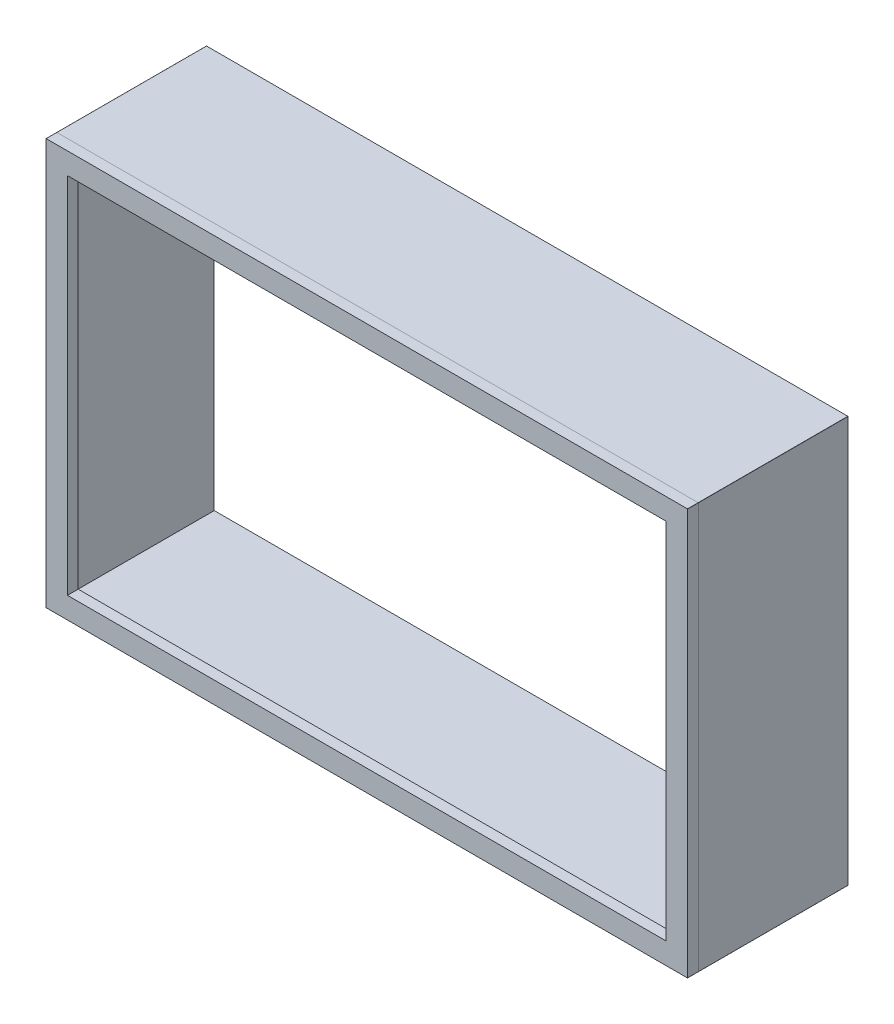
ISO-10303-21;
HEADER;
FILE_DESCRIPTION(('STEP AP214'),'2;1');
FILE_NAME('part.step','',(''),(''),'','','');
FILE_SCHEMA(('AUTOMOTIVE_DESIGN { 1 0 10303 214 1 1 1 1 }'));
ENDSEC;
DATA;
#1=APPLICATION_CONTEXT('core data for automotive mechanical design processes');
#2=APPLICATION_PROTOCOL_DEFINITION('international standard','automotive_design',2000,#1);
#3=PRODUCT_CONTEXT('',#1,'mechanical');
#4=PRODUCT('Part','Part','',(#3));
#5=PRODUCT_RELATED_PRODUCT_CATEGORY('part','',(#4));
#6=PRODUCT_DEFINITION_FORMATION('','',#4);
#7=PRODUCT_DEFINITION_CONTEXT('part definition',#1,'design');
#8=PRODUCT_DEFINITION('design','',#6,#7);
#9=PRODUCT_DEFINITION_SHAPE('','',#8);
#10=(LENGTH_UNIT() NAMED_UNIT(*) SI_UNIT(.MILLI.,.METRE.));
#11=(NAMED_UNIT(*) PLANE_ANGLE_UNIT() SI_UNIT($,.RADIAN.));
#12=(NAMED_UNIT(*) SI_UNIT($,.STERADIAN.) SOLID_ANGLE_UNIT());
#13=UNCERTAINTY_MEASURE_WITH_UNIT(LENGTH_MEASURE(1.E-05),#10,'distance_accuracy_value','');
#14=(GEOMETRIC_REPRESENTATION_CONTEXT(3) GLOBAL_UNCERTAINTY_ASSIGNED_CONTEXT((#13)) GLOBAL_UNIT_ASSIGNED_CONTEXT((#10,
#11,#12)) REPRESENTATION_CONTEXT('',''));
#15=CARTESIAN_POINT('',(0.,0.,0.));
#16=DIRECTION('',(0.,0.,1.));
#17=DIRECTION('',(1.,0.,0.));
#18=AXIS2_PLACEMENT_3D('',#15,#16,#17);
#19=CARTESIAN_POINT('',(-761.746,-482.346,228.6));
#20=DIRECTION('',(0.,0.,1.));
#21=DIRECTION('',(1.,0.,0.));
#22=AXIS2_PLACEMENT_3D('',#19,#20,#21);
#23=PLANE('',#22);
#24=CARTESIAN_POINT('',(-761.746,-482.346,228.6));
#25=DIRECTION('',(0.,0.,1.));
#26=DIRECTION('',(1.,0.,0.));
#27=AXIS2_PLACEMENT_3D('',#24,#25,#26);
#28=CIRCLE('',#27,0.253999999999921);
#29=CARTESIAN_POINT('',(-762.,-482.346,228.6));
#30=VERTEX_POINT('',#29);
#31=CARTESIAN_POINT('',(-761.746,-482.6,228.6));
#32=VERTEX_POINT('',#31);
#33=EDGE_CURVE('E278',#30,#32,#28,.T.);
#34=ORIENTED_EDGE('',*,*,#33,.T.);
#35=DIRECTION('',(1.,0.,0.));
#36=VECTOR('',#35,1.);
#37=CARTESIAN_POINT('',(-761.746,-482.6,228.6));
#38=LINE('',#37,#36);
#39=CARTESIAN_POINT('',(761.746,-482.6,228.6));
#40=VERTEX_POINT('',#39);
#41=EDGE_CURVE('E281',#32,#40,#38,.T.);
#42=ORIENTED_EDGE('',*,*,#41,.T.);
#43=CARTESIAN_POINT('',(761.746,-482.346,228.6));
#44=DIRECTION('',(0.,0.,1.));
#45=DIRECTION('',(1.,0.,0.));
#46=AXIS2_PLACEMENT_3D('',#43,#44,#45);
#47=CIRCLE('',#46,0.254000000000004);
#48=CARTESIAN_POINT('',(762.,-482.346,228.6));
#49=VERTEX_POINT('',#48);
#50=EDGE_CURVE('E284',#40,#49,#47,.T.);
#51=ORIENTED_EDGE('',*,*,#50,.T.);
#52=DIRECTION('',(0.,1.,0.));
#53=VECTOR('',#52,1.);
#54=CARTESIAN_POINT('',(762.,-482.346,228.6));
#55=LINE('',#54,#53);
#56=CARTESIAN_POINT('',(762.,482.346,228.6));
#57=VERTEX_POINT('',#56);
#58=EDGE_CURVE('E286',#49,#57,#55,.T.);
#59=ORIENTED_EDGE('',*,*,#58,.T.);
#60=CARTESIAN_POINT('',(761.746,482.346,228.6));
#61=DIRECTION('',(0.,0.,1.));
#62=DIRECTION('',(1.,0.,0.));
#63=AXIS2_PLACEMENT_3D('',#60,#61,#62);
#64=CIRCLE('',#63,0.253999999999976);
#65=CARTESIAN_POINT('',(761.746,482.6,228.6));
#66=VERTEX_POINT('',#65);
#67=EDGE_CURVE('E288',#57,#66,#64,.T.);
#68=ORIENTED_EDGE('',*,*,#67,.T.);
#69=DIRECTION('',(-1.,0.,0.));
#70=VECTOR('',#69,1.);
#71=CARTESIAN_POINT('',(761.746,482.6,228.6));
#72=LINE('',#71,#70);
#73=CARTESIAN_POINT('',(-761.746,482.6,228.6));
#74=VERTEX_POINT('',#73);
#75=EDGE_CURVE('E290',#66,#74,#72,.T.);
#76=ORIENTED_EDGE('',*,*,#75,.T.);
#77=CARTESIAN_POINT('',(-761.746,482.346,228.6));
#78=DIRECTION('',(0.,0.,1.));
#79=DIRECTION('',(1.,0.,0.));
#80=AXIS2_PLACEMENT_3D('',#77,#78,#79);
#81=CIRCLE('',#80,0.253999999999976);
#82=CARTESIAN_POINT('',(-762.,482.346,228.6));
#83=VERTEX_POINT('',#82);
#84=EDGE_CURVE('E292',#74,#83,#81,.T.);
#85=ORIENTED_EDGE('',*,*,#84,.T.);
#86=DIRECTION('',(0.,-1.,0.));
#87=VECTOR('',#86,1.);
#88=CARTESIAN_POINT('',(-762.,482.346,228.6));
#89=LINE('',#88,#87);
#90=EDGE_CURVE('E294',#83,#30,#89,.T.);
#91=ORIENTED_EDGE('',*,*,#90,.T.);
#92=EDGE_LOOP('',(#34,#42,#51,#59,#68,#76,#85,#91));
#93=FACE_BOUND('',#92,.T.);
#94=DIRECTION('',(0.,1.,0.));
#95=VECTOR('',#94,1.);
#96=CARTESIAN_POINT('',(711.2,-482.346,228.6));
#97=LINE('',#96,#95);
#98=CARTESIAN_POINT('',(711.2,-431.8,228.6));
#99=VERTEX_POINT('',#98);
#100=CARTESIAN_POINT('',(711.2,431.8,228.6));
#101=VERTEX_POINT('',#100);
#102=EDGE_CURVE('E250',#99,#101,#97,.T.);
#103=ORIENTED_EDGE('',*,*,#102,.F.);
#104=DIRECTION('',(1.,0.,0.));
#105=VECTOR('',#104,1.);
#106=CARTESIAN_POINT('',(-761.746,-431.8,228.6));
#107=LINE('',#106,#105);
#108=CARTESIAN_POINT('',(-711.2,-431.8,228.6));
#109=VERTEX_POINT('',#108);
#110=EDGE_CURVE('E242',#109,#99,#107,.T.);
#111=ORIENTED_EDGE('',*,*,#110,.F.);
#112=DIRECTION('',(0.,-1.,0.));
#113=VECTOR('',#112,1.);
#114=CARTESIAN_POINT('',(-711.2,482.346,228.6));
#115=LINE('',#114,#113);
#116=CARTESIAN_POINT('',(-711.2,431.8,228.6));
#117=VERTEX_POINT('',#116);
#118=EDGE_CURVE('E264',#117,#109,#115,.T.);
#119=ORIENTED_EDGE('',*,*,#118,.F.);
#120=DIRECTION('',(-1.,0.,0.));
#121=VECTOR('',#120,1.);
#122=CARTESIAN_POINT('',(761.746,431.8,228.6));
#123=LINE('',#122,#121);
#124=EDGE_CURVE('E262',#101,#117,#123,.T.);
#125=ORIENTED_EDGE('',*,*,#124,.F.);
#126=EDGE_LOOP('',(#103,#111,#119,#125));
#127=FACE_BOUND('',#126,.T.);
#128=ADVANCED_FACE('F153',(#93,#127),#23,.T.);
#129=CARTESIAN_POINT('',(-761.746,-482.346,203.2));
#130=DIRECTION('',(0.,0.,1.));
#131=DIRECTION('',(1.,0.,0.));
#132=AXIS2_PLACEMENT_3D('',#129,#130,#131);
#133=PLANE('',#132);
#134=CARTESIAN_POINT('',(-761.746,-482.346,203.2));
#135=DIRECTION('',(0.,0.,1.));
#136=DIRECTION('',(1.,0.,0.));
#137=AXIS2_PLACEMENT_3D('',#134,#135,#136);
#138=CIRCLE('',#137,0.253999999999921);
#139=CARTESIAN_POINT('',(-762.,-482.346,203.2));
#140=VERTEX_POINT('',#139);
#141=CARTESIAN_POINT('',(-761.746,-482.6,203.2));
#142=VERTEX_POINT('',#141);
#143=EDGE_CURVE('E258',#140,#142,#138,.T.);
#144=ORIENTED_EDGE('',*,*,#143,.F.);
#145=DIRECTION('',(0.,-1.,0.));
#146=VECTOR('',#145,1.);
#147=CARTESIAN_POINT('',(-762.,482.346,203.2));
#148=LINE('',#147,#146);
#149=CARTESIAN_POINT('',(-762.,482.346,203.2));
#150=VERTEX_POINT('',#149);
#151=EDGE_CURVE('E282',#150,#140,#148,.T.);
#152=ORIENTED_EDGE('',*,*,#151,.F.);
#153=CARTESIAN_POINT('',(-761.746,482.346,203.2));
#154=DIRECTION('',(0.,0.,1.));
#155=DIRECTION('',(1.,0.,0.));
#156=AXIS2_PLACEMENT_3D('',#153,#154,#155);
#157=CIRCLE('',#156,0.253999999999976);
#158=CARTESIAN_POINT('',(-761.746,482.6,203.2));
#159=VERTEX_POINT('',#158);
#160=EDGE_CURVE('E309',#159,#150,#157,.T.);
#161=ORIENTED_EDGE('',*,*,#160,.F.);
#162=DIRECTION('',(-1.,0.,0.));
#163=VECTOR('',#162,1.);
#164=CARTESIAN_POINT('',(761.746,482.6,203.2));
#165=LINE('',#164,#163);
#166=CARTESIAN_POINT('',(761.746,482.6,203.2));
#167=VERTEX_POINT('',#166);
#168=EDGE_CURVE('E307',#167,#159,#165,.T.);
#169=ORIENTED_EDGE('',*,*,#168,.F.);
#170=CARTESIAN_POINT('',(761.746,482.346,203.2));
#171=DIRECTION('',(0.,0.,1.));
#172=DIRECTION('',(1.,0.,0.));
#173=AXIS2_PLACEMENT_3D('',#170,#171,#172);
#174=CIRCLE('',#173,0.253999999999976);
#175=CARTESIAN_POINT('',(762.,482.346,203.2));
#176=VERTEX_POINT('',#175);
#177=EDGE_CURVE('E305',#176,#167,#174,.T.);
#178=ORIENTED_EDGE('',*,*,#177,.F.);
#179=DIRECTION('',(0.,1.,0.));
#180=VECTOR('',#179,1.);
#181=CARTESIAN_POINT('',(762.,-482.346,203.2));
#182=LINE('',#181,#180);
#183=CARTESIAN_POINT('',(762.,-482.346,203.2));
#184=VERTEX_POINT('',#183);
#185=EDGE_CURVE('E303',#184,#176,#182,.T.);
#186=ORIENTED_EDGE('',*,*,#185,.F.);
#187=CARTESIAN_POINT('',(761.746,-482.346,203.2));
#188=DIRECTION('',(0.,0.,1.));
#189=DIRECTION('',(1.,0.,0.));
#190=AXIS2_PLACEMENT_3D('',#187,#188,#189);
#191=CIRCLE('',#190,0.254000000000004);
#192=CARTESIAN_POINT('',(761.746,-482.6,203.2));
#193=VERTEX_POINT('',#192);
#194=EDGE_CURVE('E301',#193,#184,#191,.T.);
#195=ORIENTED_EDGE('',*,*,#194,.F.);
#196=DIRECTION('',(1.,0.,0.));
#197=VECTOR('',#196,1.);
#198=CARTESIAN_POINT('',(-761.746,-482.6,203.2));
#199=LINE('',#198,#197);
#200=EDGE_CURVE('E299',#142,#193,#199,.T.);
#201=ORIENTED_EDGE('',*,*,#200,.F.);
#202=EDGE_LOOP('',(#144,#152,#161,#169,#178,#186,#195,#201));
#203=FACE_BOUND('',#202,.T.);
#204=DIRECTION('',(1.,0.,0.));
#205=VECTOR('',#204,1.);
#206=CARTESIAN_POINT('',(-761.746,-431.8,203.2));
#207=LINE('',#206,#205);
#208=CARTESIAN_POINT('',(-711.2,-431.8,203.2));
#209=VERTEX_POINT('',#208);
#210=CARTESIAN_POINT('',(711.2,-431.8,203.2));
#211=VERTEX_POINT('',#210);
#212=EDGE_CURVE('E176',#209,#211,#207,.T.);
#213=ORIENTED_EDGE('',*,*,#212,.T.);
#214=DIRECTION('',(0.,1.,0.));
#215=VECTOR('',#214,1.);
#216=CARTESIAN_POINT('',(711.2,-482.346,203.2));
#217=LINE('',#216,#215);
#218=CARTESIAN_POINT('',(711.2,431.8,203.2));
#219=VERTEX_POINT('',#218);
#220=EDGE_CURVE('E257',#211,#219,#217,.T.);
#221=ORIENTED_EDGE('',*,*,#220,.T.);
#222=DIRECTION('',(-1.,0.,0.));
#223=VECTOR('',#222,1.);
#224=CARTESIAN_POINT('',(761.746,431.8,203.2));
#225=LINE('',#224,#223);
#226=CARTESIAN_POINT('',(-711.2,431.8,203.2));
#227=VERTEX_POINT('',#226);
#228=EDGE_CURVE('E270',#219,#227,#225,.T.);
#229=ORIENTED_EDGE('',*,*,#228,.T.);
#230=DIRECTION('',(0.,-1.,0.));
#231=VECTOR('',#230,1.);
#232=CARTESIAN_POINT('',(-711.2,482.346,203.2));
#233=LINE('',#232,#231);
#234=EDGE_CURVE('E251',#227,#209,#233,.T.);
#235=ORIENTED_EDGE('',*,*,#234,.T.);
#236=EDGE_LOOP('',(#213,#221,#229,#235));
#237=FACE_BOUND('',#236,.T.);
#238=ADVANCED_FACE('F339',(#203,#237),#133,.F.);
#239=CARTESIAN_POINT('',(-761.746,-482.346,228.6));
#240=DIRECTION('',(0.,0.,-1.));
#241=DIRECTION('',(-1.,0.,0.));
#242=AXIS2_PLACEMENT_3D('',#239,#240,#241);
#243=CYLINDRICAL_SURFACE('',#242,0.253999999999921);
#244=ORIENTED_EDGE('',*,*,#143,.T.);
#245=DIRECTION('',(0.,0.,-1.));
#246=VECTOR('',#245,1.);
#247=CARTESIAN_POINT('',(-761.746,-482.6,228.6));
#248=LINE('',#247,#246);
#249=EDGE_CURVE('E13',#32,#142,#248,.T.);
#250=ORIENTED_EDGE('',*,*,#249,.F.);
#251=ORIENTED_EDGE('',*,*,#33,.F.);
#252=DIRECTION('',(0.,0.,-1.));
#253=VECTOR('',#252,1.);
#254=CARTESIAN_POINT('',(-762.,-482.346,228.6));
#255=LINE('',#254,#253);
#256=EDGE_CURVE('E296',#30,#140,#255,.T.);
#257=ORIENTED_EDGE('',*,*,#256,.T.);
#258=EDGE_LOOP('',(#244,#250,#251,#257));
#259=FACE_BOUND('',#258,.T.);
#260=ADVANCED_FACE('F155',(#259),#243,.T.);
#261=CARTESIAN_POINT('',(-761.746,-482.6,228.6));
#262=DIRECTION('',(0.,1.,0.));
#263=DIRECTION('',(-1.,0.,0.));
#264=AXIS2_PLACEMENT_3D('',#261,#262,#263);
#265=PLANE('',#264);
#266=ORIENTED_EDGE('',*,*,#200,.T.);
#267=DIRECTION('',(0.,0.,-1.));
#268=VECTOR('',#267,1.);
#269=CARTESIAN_POINT('',(761.746,-482.6,228.6));
#270=LINE('',#269,#268);
#271=EDGE_CURVE('E161',#40,#193,#270,.T.);
#272=ORIENTED_EDGE('',*,*,#271,.F.);
#273=ORIENTED_EDGE('',*,*,#41,.F.);
#274=ORIENTED_EDGE('',*,*,#249,.T.);
#275=EDGE_LOOP('',(#266,#272,#273,#274));
#276=FACE_BOUND('',#275,.T.);
#277=ADVANCED_FACE('F356',(#276),#265,.F.);
#278=CARTESIAN_POINT('',(761.746,-482.346,228.6));
#279=DIRECTION('',(0.,0.,-1.));
#280=DIRECTION('',(-1.,0.,0.));
#281=AXIS2_PLACEMENT_3D('',#278,#279,#280);
#282=CYLINDRICAL_SURFACE('',#281,0.254000000000004);
#283=ORIENTED_EDGE('',*,*,#194,.T.);
#284=DIRECTION('',(0.,0.,-1.));
#285=VECTOR('',#284,1.);
#286=CARTESIAN_POINT('',(762.,-482.346,228.6));
#287=LINE('',#286,#285);
#288=EDGE_CURVE('E326',#49,#184,#287,.T.);
#289=ORIENTED_EDGE('',*,*,#288,.F.);
#290=ORIENTED_EDGE('',*,*,#50,.F.);
#291=ORIENTED_EDGE('',*,*,#271,.T.);
#292=EDGE_LOOP('',(#283,#289,#290,#291));
#293=FACE_BOUND('',#292,.T.);
#294=ADVANCED_FACE('F333',(#293),#282,.T.);
#295=CARTESIAN_POINT('',(762.,-482.346,228.6));
#296=DIRECTION('',(-1.,0.,0.));
#297=DIRECTION('',(0.,0.,1.));
#298=AXIS2_PLACEMENT_3D('',#295,#296,#297);
#299=PLANE('',#298);
#300=ORIENTED_EDGE('',*,*,#185,.T.);
#301=DIRECTION('',(0.,0.,-1.));
#302=VECTOR('',#301,1.);
#303=CARTESIAN_POINT('',(762.,482.346,228.6));
#304=LINE('',#303,#302);
#305=EDGE_CURVE('E323',#57,#176,#304,.T.);
#306=ORIENTED_EDGE('',*,*,#305,.F.);
#307=ORIENTED_EDGE('',*,*,#58,.F.);
#308=ORIENTED_EDGE('',*,*,#288,.T.);
#309=EDGE_LOOP('',(#300,#306,#307,#308));
#310=FACE_BOUND('',#309,.T.);
#311=ADVANCED_FACE('F345',(#310),#299,.F.);
#312=CARTESIAN_POINT('',(761.746,482.346,228.6));
#313=DIRECTION('',(0.,0.,-1.));
#314=DIRECTION('',(-1.,0.,0.));
#315=AXIS2_PLACEMENT_3D('',#312,#313,#314);
#316=CYLINDRICAL_SURFACE('',#315,0.253999999999976);
#317=ORIENTED_EDGE('',*,*,#177,.T.);
#318=DIRECTION('',(0.,0.,-1.));
#319=VECTOR('',#318,1.);
#320=CARTESIAN_POINT('',(761.746,482.6,228.6));
#321=LINE('',#320,#319);
#322=EDGE_CURVE('E320',#66,#167,#321,.T.);
#323=ORIENTED_EDGE('',*,*,#322,.F.);
#324=ORIENTED_EDGE('',*,*,#67,.F.);
#325=ORIENTED_EDGE('',*,*,#305,.T.);
#326=EDGE_LOOP('',(#317,#323,#324,#325));
#327=FACE_BOUND('',#326,.T.);
#328=ADVANCED_FACE('F349',(#327),#316,.T.);
#329=CARTESIAN_POINT('',(761.746,482.6,228.6));
#330=DIRECTION('',(0.,-1.,0.));
#331=DIRECTION('',(1.,0.,0.));
#332=AXIS2_PLACEMENT_3D('',#329,#330,#331);
#333=PLANE('',#332);
#334=ORIENTED_EDGE('',*,*,#168,.T.);
#335=DIRECTION('',(0.,0.,-1.));
#336=VECTOR('',#335,1.);
#337=CARTESIAN_POINT('',(-761.746,482.6,228.6));
#338=LINE('',#337,#336);
#339=EDGE_CURVE('E317',#74,#159,#338,.T.);
#340=ORIENTED_EDGE('',*,*,#339,.F.);
#341=ORIENTED_EDGE('',*,*,#75,.F.);
#342=ORIENTED_EDGE('',*,*,#322,.T.);
#343=EDGE_LOOP('',(#334,#340,#341,#342));
#344=FACE_BOUND('',#343,.T.);
#345=ADVANCED_FACE('F369',(#344),#333,.F.);
#346=CARTESIAN_POINT('',(-761.746,482.346,228.6));
#347=DIRECTION('',(0.,0.,-1.));
#348=DIRECTION('',(-1.,0.,0.));
#349=AXIS2_PLACEMENT_3D('',#346,#347,#348);
#350=CYLINDRICAL_SURFACE('',#349,0.253999999999976);
#351=ORIENTED_EDGE('',*,*,#160,.T.);
#352=DIRECTION('',(0.,0.,-1.));
#353=VECTOR('',#352,1.);
#354=CARTESIAN_POINT('',(-762.,482.346,228.6));
#355=LINE('',#354,#353);
#356=EDGE_CURVE('E314',#83,#150,#355,.T.);
#357=ORIENTED_EDGE('',*,*,#356,.F.);
#358=ORIENTED_EDGE('',*,*,#84,.F.);
#359=ORIENTED_EDGE('',*,*,#339,.T.);
#360=EDGE_LOOP('',(#351,#357,#358,#359));
#361=FACE_BOUND('',#360,.T.);
#362=ADVANCED_FACE('F367',(#361),#350,.T.);
#363=CARTESIAN_POINT('',(-762.,482.346,228.6));
#364=DIRECTION('',(1.,0.,0.));
#365=DIRECTION('',(0.,1.,0.));
#366=AXIS2_PLACEMENT_3D('',#363,#364,#365);
#367=PLANE('',#366);
#368=ORIENTED_EDGE('',*,*,#151,.T.);
#369=ORIENTED_EDGE('',*,*,#256,.F.);
#370=ORIENTED_EDGE('',*,*,#90,.F.);
#371=ORIENTED_EDGE('',*,*,#356,.T.);
#372=EDGE_LOOP('',(#368,#369,#370,#371));
#373=FACE_BOUND('',#372,.T.);
#374=ADVANCED_FACE('F362',(#373),#367,.F.);
#375=CARTESIAN_POINT('',(-761.746,-431.8,228.6));
#376=DIRECTION('',(0.,1.,0.));
#377=DIRECTION('',(-1.,0.,0.));
#378=AXIS2_PLACEMENT_3D('',#375,#376,#377);
#379=PLANE('',#378);
#380=ORIENTED_EDGE('',*,*,#212,.F.);
#381=DIRECTION('',(0.,0.,-1.));
#382=VECTOR('',#381,1.);
#383=CARTESIAN_POINT('',(-711.2,-431.8,228.6));
#384=LINE('',#383,#382);
#385=EDGE_CURVE('E246',#109,#209,#384,.T.);
#386=ORIENTED_EDGE('',*,*,#385,.F.);
#387=ORIENTED_EDGE('',*,*,#110,.T.);
#388=DIRECTION('',(0.,0.,-1.));
#389=VECTOR('',#388,1.);
#390=CARTESIAN_POINT('',(711.2,-431.8,228.6));
#391=LINE('',#390,#389);
#392=EDGE_CURVE('E245',#99,#211,#391,.T.);
#393=ORIENTED_EDGE('',*,*,#392,.T.);
#394=EDGE_LOOP('',(#380,#386,#387,#393));
#395=FACE_BOUND('',#394,.T.);
#396=ADVANCED_FACE('F244',(#395),#379,.T.);
#397=CARTESIAN_POINT('',(711.2,-482.346,228.6));
#398=DIRECTION('',(-1.,0.,0.));
#399=DIRECTION('',(0.,0.,1.));
#400=AXIS2_PLACEMENT_3D('',#397,#398,#399);
#401=PLANE('',#400);
#402=ORIENTED_EDGE('',*,*,#220,.F.);
#403=ORIENTED_EDGE('',*,*,#392,.F.);
#404=ORIENTED_EDGE('',*,*,#102,.T.);
#405=DIRECTION('',(0.,0.,-1.));
#406=VECTOR('',#405,1.);
#407=CARTESIAN_POINT('',(711.2,431.8,228.6));
#408=LINE('',#407,#406);
#409=EDGE_CURVE('E259',#101,#219,#408,.T.);
#410=ORIENTED_EDGE('',*,*,#409,.T.);
#411=EDGE_LOOP('',(#402,#403,#404,#410));
#412=FACE_BOUND('',#411,.T.);
#413=ADVANCED_FACE('F254',(#412),#401,.T.);
#414=CARTESIAN_POINT('',(761.746,431.8,228.6));
#415=DIRECTION('',(0.,-1.,0.));
#416=DIRECTION('',(1.,0.,0.));
#417=AXIS2_PLACEMENT_3D('',#414,#415,#416);
#418=PLANE('',#417);
#419=ORIENTED_EDGE('',*,*,#228,.F.);
#420=ORIENTED_EDGE('',*,*,#409,.F.);
#421=ORIENTED_EDGE('',*,*,#124,.T.);
#422=DIRECTION('',(0.,0.,-1.));
#423=VECTOR('',#422,1.);
#424=CARTESIAN_POINT('',(-711.2,431.8,228.6));
#425=LINE('',#424,#423);
#426=EDGE_CURVE('E168',#117,#227,#425,.T.);
#427=ORIENTED_EDGE('',*,*,#426,.T.);
#428=EDGE_LOOP('',(#419,#420,#421,#427));
#429=FACE_BOUND('',#428,.T.);
#430=ADVANCED_FACE('F394',(#429),#418,.T.);
#431=CARTESIAN_POINT('',(-711.2,482.346,228.6));
#432=DIRECTION('',(1.,0.,0.));
#433=DIRECTION('',(0.,1.,0.));
#434=AXIS2_PLACEMENT_3D('',#431,#432,#433);
#435=PLANE('',#434);
#436=ORIENTED_EDGE('',*,*,#234,.F.);
#437=ORIENTED_EDGE('',*,*,#426,.F.);
#438=ORIENTED_EDGE('',*,*,#118,.T.);
#439=ORIENTED_EDGE('',*,*,#385,.T.);
#440=EDGE_LOOP('',(#436,#437,#438,#439));
#441=FACE_BOUND('',#440,.T.);
#442=ADVANCED_FACE('F398',(#441),#435,.T.);
#443=CLOSED_SHELL('',(#128,#238,#260,#277,#294,#311,#328,#345,#362,#374,#396,#413,#430,#442));
#444=MANIFOLD_SOLID_BREP('B2',#443);
#445=CARTESIAN_POINT('',(-761.746,-482.346,-152.4));
#446=DIRECTION('',(0.,0.,1.));
#447=DIRECTION('',(1.,0.,0.));
#448=AXIS2_PLACEMENT_3D('',#445,#446,#447);
#449=CYLINDRICAL_SURFACE('',#448,0.253999999999921);
#450=DIRECTION('',(0.,0.,1.));
#451=VECTOR('',#450,1.);
#452=CARTESIAN_POINT('',(-761.746,-482.6,-152.4));
#453=LINE('',#452,#451);
#454=CARTESIAN_POINT('',(-761.746,-482.6,-152.4));
#455=VERTEX_POINT('',#454);
#456=CARTESIAN_POINT('',(-761.746,-482.6,203.2));
#457=VERTEX_POINT('',#456);
#458=EDGE_CURVE('E490',#455,#457,#453,.T.);
#459=ORIENTED_EDGE('',*,*,#458,.T.);
#460=CARTESIAN_POINT('',(-761.746,-482.346,203.2));
#461=DIRECTION('',(0.,0.,1.));
#462=DIRECTION('',(-1.,0.,0.));
#463=AXIS2_PLACEMENT_3D('',#460,#461,#462);
#464=CIRCLE('',#463,0.253999999999921);
#465=CARTESIAN_POINT('',(-762.,-482.346,203.2));
#466=VERTEX_POINT('',#465);
#467=EDGE_CURVE('E606',#466,#457,#464,.T.);
#468=ORIENTED_EDGE('',*,*,#467,.F.);
#469=DIRECTION('',(0.,0.,1.));
#470=VECTOR('',#469,1.);
#471=CARTESIAN_POINT('',(-762.,-482.346,-152.4));
#472=LINE('',#471,#470);
#473=CARTESIAN_POINT('',(-762.,-482.346,-152.4));
#474=VERTEX_POINT('',#473);
#475=EDGE_CURVE('E151',#474,#466,#472,.T.);
#476=ORIENTED_EDGE('',*,*,#475,.F.);
#477=CARTESIAN_POINT('',(-761.746,-482.346,-152.4));
#478=DIRECTION('',(0.,0.,1.));
#479=DIRECTION('',(-1.,0.,0.));
#480=AXIS2_PLACEMENT_3D('',#477,#478,#479);
#481=CIRCLE('',#480,0.253999999999921);
#482=EDGE_CURVE('E637',#474,#455,#481,.T.);
#483=ORIENTED_EDGE('',*,*,#482,.T.);
#484=EDGE_LOOP('',(#459,#468,#476,#483));
#485=FACE_BOUND('',#484,.T.);
#486=ADVANCED_FACE('F487',(#485),#449,.T.);
#487=CARTESIAN_POINT('',(-762.,-482.346,-152.4));
#488=DIRECTION('',(-1.,0.,0.));
#489=DIRECTION('',(0.,-1.,0.));
#490=AXIS2_PLACEMENT_3D('',#487,#488,#489);
#491=PLANE('',#490);
#492=ORIENTED_EDGE('',*,*,#475,.T.);
#493=DIRECTION('',(0.,-1.,0.));
#494=VECTOR('',#493,1.);
#495=CARTESIAN_POINT('',(-762.,-482.346,203.2));
#496=LINE('',#495,#494);
#497=CARTESIAN_POINT('',(-762.,482.346,203.2));
#498=VERTEX_POINT('',#497);
#499=EDGE_CURVE('E627',#498,#466,#496,.T.);
#500=ORIENTED_EDGE('',*,*,#499,.F.);
#501=DIRECTION('',(0.,0.,1.));
#502=VECTOR('',#501,1.);
#503=CARTESIAN_POINT('',(-762.,482.346,-152.4));
#504=LINE('',#503,#502);
#505=CARTESIAN_POINT('',(-762.,482.346,-152.4));
#506=VERTEX_POINT('',#505);
#507=EDGE_CURVE('E495',#506,#498,#504,.T.);
#508=ORIENTED_EDGE('',*,*,#507,.F.);
#509=DIRECTION('',(0.,-1.,0.));
#510=VECTOR('',#509,1.);
#511=CARTESIAN_POINT('',(-762.,-482.346,-152.4));
#512=LINE('',#511,#510);
#513=EDGE_CURVE('E660',#506,#474,#512,.T.);
#514=ORIENTED_EDGE('',*,*,#513,.T.);
#515=EDGE_LOOP('',(#492,#500,#508,#514));
#516=FACE_BOUND('',#515,.T.);
#517=ADVANCED_FACE('F681',(#516),#491,.T.);
#518=CARTESIAN_POINT('',(-761.746,482.346,-152.4));
#519=DIRECTION('',(0.,0.,1.));
#520=DIRECTION('',(1.,0.,0.));
#521=AXIS2_PLACEMENT_3D('',#518,#519,#520);
#522=CYLINDRICAL_SURFACE('',#521,0.253999999999976);
#523=ORIENTED_EDGE('',*,*,#507,.T.);
#524=CARTESIAN_POINT('',(-761.746,482.346,203.2));
#525=DIRECTION('',(0.,0.,1.));
#526=DIRECTION('',(1.,0.,0.));
#527=AXIS2_PLACEMENT_3D('',#524,#525,#526);
#528=CIRCLE('',#527,0.253999999999976);
#529=CARTESIAN_POINT('',(-761.746,482.6,203.2));
#530=VERTEX_POINT('',#529);
#531=EDGE_CURVE('E624',#530,#498,#528,.T.);
#532=ORIENTED_EDGE('',*,*,#531,.F.);
#533=DIRECTION('',(0.,0.,1.));
#534=VECTOR('',#533,1.);
#535=CARTESIAN_POINT('',(-761.746,482.6,-152.4));
#536=LINE('',#535,#534);
#537=CARTESIAN_POINT('',(-761.746,482.6,-152.4));
#538=VERTEX_POINT('',#537);
#539=EDGE_CURVE('E664',#538,#530,#536,.T.);
#540=ORIENTED_EDGE('',*,*,#539,.F.);
#541=CARTESIAN_POINT('',(-761.746,482.346,-152.4));
#542=DIRECTION('',(0.,0.,1.));
#543=DIRECTION('',(1.,0.,0.));
#544=AXIS2_PLACEMENT_3D('',#541,#542,#543);
#545=CIRCLE('',#544,0.253999999999976);
#546=EDGE_CURVE('E657',#538,#506,#545,.T.);
#547=ORIENTED_EDGE('',*,*,#546,.T.);
#548=EDGE_LOOP('',(#523,#532,#540,#547));
#549=FACE_BOUND('',#548,.T.);
#550=ADVANCED_FACE('F702',(#549),#522,.T.);
#551=CARTESIAN_POINT('',(761.746,482.6,-152.4));
#552=DIRECTION('',(0.,1.,0.));
#553=DIRECTION('',(-1.,0.,0.));
#554=AXIS2_PLACEMENT_3D('',#551,#552,#553);
#555=PLANE('',#554);
#556=ORIENTED_EDGE('',*,*,#539,.T.);
#557=DIRECTION('',(-1.,0.,0.));
#558=VECTOR('',#557,1.);
#559=CARTESIAN_POINT('',(761.746,482.6,203.2));
#560=LINE('',#559,#558);
#561=CARTESIAN_POINT('',(761.746,482.6,203.2));
#562=VERTEX_POINT('',#561);
#563=EDGE_CURVE('E621',#562,#530,#560,.T.);
#564=ORIENTED_EDGE('',*,*,#563,.F.);
#565=DIRECTION('',(0.,0.,1.));
#566=VECTOR('',#565,1.);
#567=CARTESIAN_POINT('',(761.746,482.6,-152.4));
#568=LINE('',#567,#566);
#569=CARTESIAN_POINT('',(761.746,482.6,-152.4));
#570=VERTEX_POINT('',#569);
#571=EDGE_CURVE('E666',#570,#562,#568,.T.);
#572=ORIENTED_EDGE('',*,*,#571,.F.);
#573=DIRECTION('',(-1.,0.,0.));
#574=VECTOR('',#573,1.);
#575=CARTESIAN_POINT('',(761.746,482.6,-152.4));
#576=LINE('',#575,#574);
#577=EDGE_CURVE('E654',#570,#538,#576,.T.);
#578=ORIENTED_EDGE('',*,*,#577,.T.);
#579=EDGE_LOOP('',(#556,#564,#572,#578));
#580=FACE_BOUND('',#579,.T.);
#581=ADVANCED_FACE('F699',(#580),#555,.T.);
#582=CARTESIAN_POINT('',(761.746,482.346,-152.4));
#583=DIRECTION('',(0.,0.,1.));
#584=DIRECTION('',(1.,0.,0.));
#585=AXIS2_PLACEMENT_3D('',#582,#583,#584);
#586=CYLINDRICAL_SURFACE('',#585,0.253999999999949);
#587=ORIENTED_EDGE('',*,*,#571,.T.);
#588=CARTESIAN_POINT('',(761.746,482.346,203.2));
#589=DIRECTION('',(0.,0.,1.));
#590=DIRECTION('',(1.,0.,0.));
#591=AXIS2_PLACEMENT_3D('',#588,#589,#590);
#592=CIRCLE('',#591,0.253999999999949);
#593=CARTESIAN_POINT('',(762.,482.346,203.2));
#594=VERTEX_POINT('',#593);
#595=EDGE_CURVE('E618',#594,#562,#592,.T.);
#596=ORIENTED_EDGE('',*,*,#595,.F.);
#597=DIRECTION('',(0.,0.,1.));
#598=VECTOR('',#597,1.);
#599=CARTESIAN_POINT('',(762.,482.346,-152.4));
#600=LINE('',#599,#598);
#601=CARTESIAN_POINT('',(762.,482.346,-152.4));
#602=VERTEX_POINT('',#601);
#603=EDGE_CURVE('E668',#602,#594,#600,.T.);
#604=ORIENTED_EDGE('',*,*,#603,.F.);
#605=CARTESIAN_POINT('',(761.746,482.346,-152.4));
#606=DIRECTION('',(0.,0.,1.));
#607=DIRECTION('',(1.,0.,0.));
#608=AXIS2_PLACEMENT_3D('',#605,#606,#607);
#609=CIRCLE('',#608,0.253999999999949);
#610=EDGE_CURVE('E651',#602,#570,#609,.T.);
#611=ORIENTED_EDGE('',*,*,#610,.T.);
#612=EDGE_LOOP('',(#587,#596,#604,#611));
#613=FACE_BOUND('',#612,.T.);
#614=ADVANCED_FACE('F697',(#613),#586,.T.);
#615=CARTESIAN_POINT('',(762.,-482.346,-152.4));
#616=DIRECTION('',(1.,0.,0.));
#617=DIRECTION('',(0.,0.,-1.));
#618=AXIS2_PLACEMENT_3D('',#615,#616,#617);
#619=PLANE('',#618);
#620=ORIENTED_EDGE('',*,*,#603,.T.);
#621=DIRECTION('',(0.,1.,0.));
#622=VECTOR('',#621,1.);
#623=CARTESIAN_POINT('',(762.,-482.346,203.2));
#624=LINE('',#623,#622);
#625=CARTESIAN_POINT('',(762.,-482.346,203.2));
#626=VERTEX_POINT('',#625);
#627=EDGE_CURVE('E615',#626,#594,#624,.T.);
#628=ORIENTED_EDGE('',*,*,#627,.F.);
#629=DIRECTION('',(0.,0.,1.));
#630=VECTOR('',#629,1.);
#631=CARTESIAN_POINT('',(762.,-482.346,-152.4));
#632=LINE('',#631,#630);
#633=CARTESIAN_POINT('',(762.,-482.346,-152.4));
#634=VERTEX_POINT('',#633);
#635=EDGE_CURVE('E670',#634,#626,#632,.T.);
#636=ORIENTED_EDGE('',*,*,#635,.F.);
#637=DIRECTION('',(0.,1.,0.));
#638=VECTOR('',#637,1.);
#639=CARTESIAN_POINT('',(762.,-482.346,-152.4));
#640=LINE('',#639,#638);
#641=EDGE_CURVE('E648',#634,#602,#640,.T.);
#642=ORIENTED_EDGE('',*,*,#641,.T.);
#643=EDGE_LOOP('',(#620,#628,#636,#642));
#644=FACE_BOUND('',#643,.T.);
#645=ADVANCED_FACE('F695',(#644),#619,.T.);
#646=CARTESIAN_POINT('',(761.746,-482.346,-152.4));
#647=DIRECTION('',(0.,0.,1.));
#648=DIRECTION('',(1.,0.,0.));
#649=AXIS2_PLACEMENT_3D('',#646,#647,#648);
#650=CYLINDRICAL_SURFACE('',#649,0.254000000000004);
#651=ORIENTED_EDGE('',*,*,#635,.T.);
#652=CARTESIAN_POINT('',(761.746,-482.346,203.2));
#653=DIRECTION('',(0.,0.,1.));
#654=DIRECTION('',(1.,0.,0.));
#655=AXIS2_PLACEMENT_3D('',#652,#653,#654);
#656=CIRCLE('',#655,0.254000000000004);
#657=CARTESIAN_POINT('',(761.746,-482.6,203.2));
#658=VERTEX_POINT('',#657);
#659=EDGE_CURVE('E612',#658,#626,#656,.T.);
#660=ORIENTED_EDGE('',*,*,#659,.F.);
#661=DIRECTION('',(0.,0.,1.));
#662=VECTOR('',#661,1.);
#663=CARTESIAN_POINT('',(761.746,-482.6,-152.4));
#664=LINE('',#663,#662);
#665=CARTESIAN_POINT('',(761.746,-482.6,-152.4));
#666=VERTEX_POINT('',#665);
#667=EDGE_CURVE('E671',#666,#658,#664,.T.);
#668=ORIENTED_EDGE('',*,*,#667,.F.);
#669=CARTESIAN_POINT('',(761.746,-482.346,-152.4));
#670=DIRECTION('',(0.,0.,1.));
#671=DIRECTION('',(1.,0.,0.));
#672=AXIS2_PLACEMENT_3D('',#669,#670,#671);
#673=CIRCLE('',#672,0.254000000000004);
#674=EDGE_CURVE('E645',#666,#634,#673,.T.);
#675=ORIENTED_EDGE('',*,*,#674,.T.);
#676=EDGE_LOOP('',(#651,#660,#668,#675));
#677=FACE_BOUND('',#676,.T.);
#678=ADVANCED_FACE('F691',(#677),#650,.T.);
#679=CARTESIAN_POINT('',(761.746,-482.6,-152.4));
#680=DIRECTION('',(0.,-1.,0.));
#681=DIRECTION('',(1.,0.,0.));
#682=AXIS2_PLACEMENT_3D('',#679,#680,#681);
#683=PLANE('',#682);
#684=ORIENTED_EDGE('',*,*,#667,.T.);
#685=DIRECTION('',(1.,0.,0.));
#686=VECTOR('',#685,1.);
#687=CARTESIAN_POINT('',(761.746,-482.6,203.2));
#688=LINE('',#687,#686);
#689=EDGE_CURVE('E609',#457,#658,#688,.T.);
#690=ORIENTED_EDGE('',*,*,#689,.F.);
#691=ORIENTED_EDGE('',*,*,#458,.F.);
#692=DIRECTION('',(1.,0.,0.));
#693=VECTOR('',#692,1.);
#694=CARTESIAN_POINT('',(761.746,-482.6,-152.4));
#695=LINE('',#694,#693);
#696=EDGE_CURVE('E642',#455,#666,#695,.T.);
#697=ORIENTED_EDGE('',*,*,#696,.T.);
#698=EDGE_LOOP('',(#684,#690,#691,#697));
#699=FACE_BOUND('',#698,.T.);
#700=ADVANCED_FACE('F675',(#699),#683,.T.);
#701=CARTESIAN_POINT('',(-761.746,-482.346,-152.4));
#702=DIRECTION('',(0.,0.,1.));
#703=DIRECTION('',(1.,0.,0.));
#704=AXIS2_PLACEMENT_3D('',#701,#702,#703);
#705=PLANE('',#704);
#706=DIRECTION('',(-1.,0.,0.));
#707=VECTOR('',#706,1.);
#708=CARTESIAN_POINT('',(-761.746,464.058,-152.4));
#709=LINE('',#708,#707);
#710=CARTESIAN_POINT('',(743.458,464.058,-152.4));
#711=VERTEX_POINT('',#710);
#712=CARTESIAN_POINT('',(-743.458,464.058,-152.4));
#713=VERTEX_POINT('',#712);
#714=EDGE_CURVE('E588',#711,#713,#709,.T.);
#715=ORIENTED_EDGE('',*,*,#714,.T.);
#716=DIRECTION('',(0.,-1.,0.));
#717=VECTOR('',#716,1.);
#718=CARTESIAN_POINT('',(-743.458,-482.346,-152.4));
#719=LINE('',#718,#717);
#720=CARTESIAN_POINT('',(-743.458,-464.058,-152.4));
#721=VERTEX_POINT('',#720);
#722=EDGE_CURVE('E630',#713,#721,#719,.T.);
#723=ORIENTED_EDGE('',*,*,#722,.T.);
#724=DIRECTION('',(1.,0.,0.));
#725=VECTOR('',#724,1.);
#726=CARTESIAN_POINT('',(-761.746,-464.058,-152.4));
#727=LINE('',#726,#725);
#728=CARTESIAN_POINT('',(743.458,-464.058,-152.4));
#729=VERTEX_POINT('',#728);
#730=EDGE_CURVE('E583',#721,#729,#727,.T.);
#731=ORIENTED_EDGE('',*,*,#730,.T.);
#732=DIRECTION('',(0.,1.,0.));
#733=VECTOR('',#732,1.);
#734=CARTESIAN_POINT('',(743.458,-482.346,-152.4));
#735=LINE('',#734,#733);
#736=EDGE_CURVE('E503',#729,#711,#735,.T.);
#737=ORIENTED_EDGE('',*,*,#736,.T.);
#738=EDGE_LOOP('',(#715,#723,#731,#737));
#739=FACE_BOUND('',#738,.T.);
#740=ORIENTED_EDGE('',*,*,#482,.F.);
#741=ORIENTED_EDGE('',*,*,#513,.F.);
#742=ORIENTED_EDGE('',*,*,#546,.F.);
#743=ORIENTED_EDGE('',*,*,#577,.F.);
#744=ORIENTED_EDGE('',*,*,#610,.F.);
#745=ORIENTED_EDGE('',*,*,#641,.F.);
#746=ORIENTED_EDGE('',*,*,#674,.F.);
#747=ORIENTED_EDGE('',*,*,#696,.F.);
#748=EDGE_LOOP('',(#740,#741,#742,#743,#744,#745,#746,#747));
#749=FACE_BOUND('',#748,.T.);
#750=ADVANCED_FACE('F685',(#739,#749),#705,.F.);
#751=CARTESIAN_POINT('',(-743.458,-482.346,-152.4));
#752=DIRECTION('',(-1.,0.,0.));
#753=DIRECTION('',(0.,-1.,0.));
#754=AXIS2_PLACEMENT_3D('',#751,#752,#753);
#755=PLANE('',#754);
#756=DIRECTION('',(0.,0.,1.));
#757=VECTOR('',#756,1.);
#758=CARTESIAN_POINT('',(-743.458,464.058,-152.4));
#759=LINE('',#758,#757);
#760=CARTESIAN_POINT('',(-743.458,464.058,203.2));
#761=VERTEX_POINT('',#760);
#762=EDGE_CURVE('E593',#713,#761,#759,.T.);
#763=ORIENTED_EDGE('',*,*,#762,.T.);
#764=DIRECTION('',(0.,-1.,0.));
#765=VECTOR('',#764,1.);
#766=CARTESIAN_POINT('',(-743.458,-482.346,203.2));
#767=LINE('',#766,#765);
#768=CARTESIAN_POINT('',(-743.458,-464.058,203.2));
#769=VERTEX_POINT('',#768);
#770=EDGE_CURVE('E591',#761,#769,#767,.T.);
#771=ORIENTED_EDGE('',*,*,#770,.T.);
#772=DIRECTION('',(0.,0.,1.));
#773=VECTOR('',#772,1.);
#774=CARTESIAN_POINT('',(-743.458,-464.058,-152.4));
#775=LINE('',#774,#773);
#776=EDGE_CURVE('E576',#721,#769,#775,.T.);
#777=ORIENTED_EDGE('',*,*,#776,.F.);
#778=ORIENTED_EDGE('',*,*,#722,.F.);
#779=EDGE_LOOP('',(#763,#771,#777,#778));
#780=FACE_BOUND('',#779,.T.);
#781=ADVANCED_FACE('F592',(#780),#755,.F.);
#782=CARTESIAN_POINT('',(-761.746,464.058,-152.4));
#783=DIRECTION('',(0.,1.,0.));
#784=DIRECTION('',(-1.,0.,0.));
#785=AXIS2_PLACEMENT_3D('',#782,#783,#784);
#786=PLANE('',#785);
#787=DIRECTION('',(0.,0.,1.));
#788=VECTOR('',#787,1.);
#789=CARTESIAN_POINT('',(743.458,464.058,-152.4));
#790=LINE('',#789,#788);
#791=CARTESIAN_POINT('',(743.458,464.058,203.2));
#792=VERTEX_POINT('',#791);
#793=EDGE_CURVE('E638',#711,#792,#790,.T.);
#794=ORIENTED_EDGE('',*,*,#793,.T.);
#795=DIRECTION('',(-1.,0.,0.));
#796=VECTOR('',#795,1.);
#797=CARTESIAN_POINT('',(-761.746,464.058,203.2));
#798=LINE('',#797,#796);
#799=EDGE_CURVE('E602',#792,#761,#798,.T.);
#800=ORIENTED_EDGE('',*,*,#799,.T.);
#801=ORIENTED_EDGE('',*,*,#762,.F.);
#802=ORIENTED_EDGE('',*,*,#714,.F.);
#803=EDGE_LOOP('',(#794,#800,#801,#802));
#804=FACE_BOUND('',#803,.T.);
#805=ADVANCED_FACE('F777',(#804),#786,.F.);
#806=CARTESIAN_POINT('',(743.458,-482.346,-152.4));
#807=DIRECTION('',(1.,0.,0.));
#808=DIRECTION('',(0.,0.,-1.));
#809=AXIS2_PLACEMENT_3D('',#806,#807,#808);
#810=PLANE('',#809);
#811=DIRECTION('',(0.,0.,1.));
#812=VECTOR('',#811,1.);
#813=CARTESIAN_POINT('',(743.458,-464.058,-152.4));
#814=LINE('',#813,#812);
#815=CARTESIAN_POINT('',(743.458,-464.058,203.2));
#816=VERTEX_POINT('',#815);
#817=EDGE_CURVE('E587',#729,#816,#814,.T.);
#818=ORIENTED_EDGE('',*,*,#817,.T.);
#819=DIRECTION('',(0.,1.,0.));
#820=VECTOR('',#819,1.);
#821=CARTESIAN_POINT('',(743.458,-482.346,203.2));
#822=LINE('',#821,#820);
#823=EDGE_CURVE('E600',#816,#792,#822,.T.);
#824=ORIENTED_EDGE('',*,*,#823,.T.);
#825=ORIENTED_EDGE('',*,*,#793,.F.);
#826=ORIENTED_EDGE('',*,*,#736,.F.);
#827=EDGE_LOOP('',(#818,#824,#825,#826));
#828=FACE_BOUND('',#827,.T.);
#829=ADVANCED_FACE('F786',(#828),#810,.F.);
#830=CARTESIAN_POINT('',(-761.746,-464.058,-152.4));
#831=DIRECTION('',(0.,-1.,0.));
#832=DIRECTION('',(1.,0.,0.));
#833=AXIS2_PLACEMENT_3D('',#830,#831,#832);
#834=PLANE('',#833);
#835=ORIENTED_EDGE('',*,*,#776,.T.);
#836=DIRECTION('',(1.,0.,0.));
#837=VECTOR('',#836,1.);
#838=CARTESIAN_POINT('',(-761.746,-464.058,203.2));
#839=LINE('',#838,#837);
#840=EDGE_CURVE('E580',#769,#816,#839,.T.);
#841=ORIENTED_EDGE('',*,*,#840,.T.);
#842=ORIENTED_EDGE('',*,*,#817,.F.);
#843=ORIENTED_EDGE('',*,*,#730,.F.);
#844=EDGE_LOOP('',(#835,#841,#842,#843));
#845=FACE_BOUND('',#844,.T.);
#846=ADVANCED_FACE('F578',(#845),#834,.F.);
#847=CARTESIAN_POINT('',(-761.746,-482.346,203.2));
#848=DIRECTION('',(0.,0.,1.));
#849=DIRECTION('',(1.,0.,0.));
#850=AXIS2_PLACEMENT_3D('',#847,#848,#849);
#851=PLANE('',#850);
#852=ORIENTED_EDGE('',*,*,#467,.T.);
#853=ORIENTED_EDGE('',*,*,#689,.T.);
#854=ORIENTED_EDGE('',*,*,#659,.T.);
#855=ORIENTED_EDGE('',*,*,#627,.T.);
#856=ORIENTED_EDGE('',*,*,#595,.T.);
#857=ORIENTED_EDGE('',*,*,#563,.T.);
#858=ORIENTED_EDGE('',*,*,#531,.T.);
#859=ORIENTED_EDGE('',*,*,#499,.T.);
#860=EDGE_LOOP('',(#852,#853,#854,#855,#856,#857,#858,#859));
#861=FACE_BOUND('',#860,.T.);
#862=ORIENTED_EDGE('',*,*,#840,.F.);
#863=ORIENTED_EDGE('',*,*,#770,.F.);
#864=ORIENTED_EDGE('',*,*,#799,.F.);
#865=ORIENTED_EDGE('',*,*,#823,.F.);
#866=EDGE_LOOP('',(#862,#863,#864,#865));
#867=FACE_BOUND('',#866,.T.);
#868=ADVANCED_FACE('F598',(#861,#867),#851,.T.);
#869=CLOSED_SHELL('',(#486,#517,#550,#581,#614,#645,#678,#700,#750,#781,#805,#829,#846,#868));
#870=MANIFOLD_SOLID_BREP('B7',#869);
#871=ADVANCED_BREP_SHAPE_REPRESENTATION('',(#18,#444,#870),#14);
#872=SHAPE_DEFINITION_REPRESENTATION(#9,#871);
ENDSEC;
END-ISO-10303-21;
